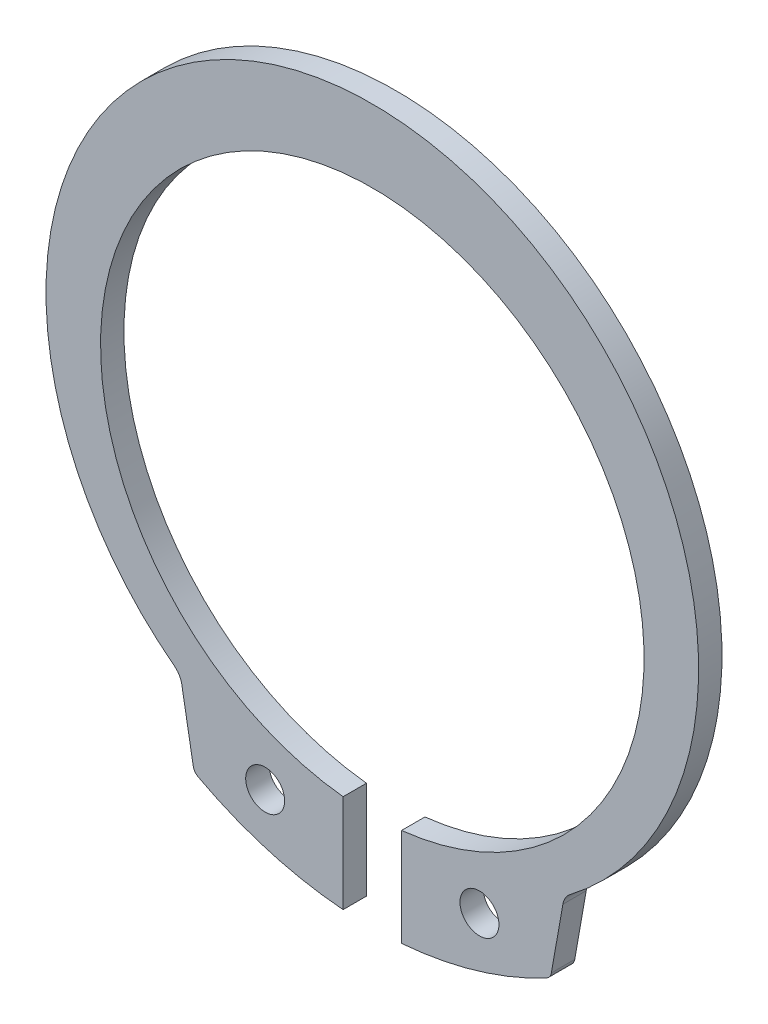
ISO-10303-21;
HEADER;
FILE_DESCRIPTION(('STEP AP214'),'2;1');
FILE_NAME('part.step','',(''),(''),'','','');
FILE_SCHEMA(('AUTOMOTIVE_DESIGN { 1 0 10303 214 1 1 1 1 }'));
ENDSEC;
DATA;
#1=APPLICATION_CONTEXT('core data for automotive mechanical design processes');
#2=APPLICATION_PROTOCOL_DEFINITION('international standard','automotive_design',2000,#1);
#3=PRODUCT_CONTEXT('',#1,'mechanical');
#4=PRODUCT('Part','Part','',(#3));
#5=PRODUCT_RELATED_PRODUCT_CATEGORY('part','',(#4));
#6=PRODUCT_DEFINITION_FORMATION('','',#4);
#7=PRODUCT_DEFINITION_CONTEXT('part definition',#1,'design');
#8=PRODUCT_DEFINITION('design','',#6,#7);
#9=PRODUCT_DEFINITION_SHAPE('','',#8);
#10=(LENGTH_UNIT() NAMED_UNIT(*) SI_UNIT(.MILLI.,.METRE.));
#11=(NAMED_UNIT(*) PLANE_ANGLE_UNIT() SI_UNIT($,.RADIAN.));
#12=(NAMED_UNIT(*) SI_UNIT($,.STERADIAN.) SOLID_ANGLE_UNIT());
#13=UNCERTAINTY_MEASURE_WITH_UNIT(LENGTH_MEASURE(1.E-05),#10,'distance_accuracy_value','');
#14=(GEOMETRIC_REPRESENTATION_CONTEXT(3) GLOBAL_UNCERTAINTY_ASSIGNED_CONTEXT((#13)) GLOBAL_UNIT_ASSIGNED_CONTEXT((#10,
#11,#12)) REPRESENTATION_CONTEXT('',''));
#15=CARTESIAN_POINT('',(0.,0.,0.));
#16=DIRECTION('',(0.,0.,1.));
#17=DIRECTION('',(1.,0.,0.));
#18=AXIS2_PLACEMENT_3D('',#15,#16,#17);
#19=CARTESIAN_POINT('',(0.,-0.93,-1.2));
#20=DIRECTION('',(0.,0.,1.));
#21=DIRECTION('',(1.,0.,0.));
#22=AXIS2_PLACEMENT_3D('',#19,#20,#21);
#23=CYLINDRICAL_SURFACE('',#22,18.95);
#24=CARTESIAN_POINT('',(0.,-0.93,-1.2));
#25=DIRECTION('',(0.,0.,1.));
#26=DIRECTION('',(-1.,0.,0.));
#27=AXIS2_PLACEMENT_3D('',#24,#25,#26);
#28=CIRCLE('',#27,18.95);
#29=CARTESIAN_POINT('',(1.5,-19.8205399605199,-1.2));
#30=VERTEX_POINT('',#29);
#31=CARTESIAN_POINT('',(8.93451802374441,-17.6415794490942,-1.2));
#32=VERTEX_POINT('',#31);
#33=EDGE_CURVE('E175',#30,#32,#28,.T.);
#34=ORIENTED_EDGE('',*,*,#33,.T.);
#35=DIRECTION('',(0.,0.,1.));
#36=VECTOR('',#35,1.);
#37=CARTESIAN_POINT('',(8.93451802374442,-17.6415794490942,-1.2));
#38=LINE('',#37,#36);
#39=CARTESIAN_POINT('',(8.93451802374441,-17.6415794490942,0.));
#40=VERTEX_POINT('',#39);
#41=EDGE_CURVE('E193',#32,#40,#38,.T.);
#42=ORIENTED_EDGE('',*,*,#41,.T.);
#43=CARTESIAN_POINT('',(0.,-0.93,0.));
#44=DIRECTION('',(0.,0.,1.));
#45=DIRECTION('',(-1.,0.,0.));
#46=AXIS2_PLACEMENT_3D('',#43,#44,#45);
#47=CIRCLE('',#46,18.95);
#48=CARTESIAN_POINT('',(1.5,-19.8205399605199,0.));
#49=VERTEX_POINT('',#48);
#50=EDGE_CURVE('E155',#49,#40,#47,.T.);
#51=ORIENTED_EDGE('',*,*,#50,.F.);
#52=DIRECTION('',(0.,0.,1.));
#53=VECTOR('',#52,1.);
#54=CARTESIAN_POINT('',(1.5,-19.8205399605199,-1.2));
#55=LINE('',#54,#53);
#56=EDGE_CURVE('E176',#30,#49,#55,.T.);
#57=ORIENTED_EDGE('',*,*,#56,.F.);
#58=EDGE_LOOP('',(#34,#42,#51,#57));
#59=FACE_BOUND('',#58,.T.);
#60=ADVANCED_FACE('F34',(#59),#23,.T.);
#61=CARTESIAN_POINT('',(1.5,-14.7991203758566,-1.2));
#62=DIRECTION('',(-1.,0.,0.));
#63=DIRECTION('',(0.,0.,1.));
#64=AXIS2_PLACEMENT_3D('',#61,#62,#63);
#65=PLANE('',#64);
#66=DIRECTION('',(0.,-1.,0.));
#67=VECTOR('',#66,1.);
#68=CARTESIAN_POINT('',(1.5,-14.7991203758566,0.));
#69=LINE('',#68,#67);
#70=CARTESIAN_POINT('',(1.5,-14.7991203758566,0.));
#71=VERTEX_POINT('',#70);
#72=EDGE_CURVE('E172',#71,#49,#69,.T.);
#73=ORIENTED_EDGE('',*,*,#72,.F.);
#74=DIRECTION('',(0.,0.,1.));
#75=VECTOR('',#74,1.);
#76=CARTESIAN_POINT('',(1.5,-14.7991203758566,-1.2));
#77=LINE('',#76,#75);
#78=CARTESIAN_POINT('',(1.5,-14.7991203758566,-1.2));
#79=VERTEX_POINT('',#78);
#80=EDGE_CURVE('E179',#79,#71,#77,.T.);
#81=ORIENTED_EDGE('',*,*,#80,.F.);
#82=DIRECTION('',(0.,-1.,0.));
#83=VECTOR('',#82,1.);
#84=CARTESIAN_POINT('',(1.5,-14.7991203758566,-1.2));
#85=LINE('',#84,#83);
#86=EDGE_CURVE('E142',#79,#30,#85,.T.);
#87=ORIENTED_EDGE('',*,*,#86,.T.);
#88=ORIENTED_EDGE('',*,*,#56,.T.);
#89=EDGE_LOOP('',(#73,#81,#87,#88));
#90=FACE_BOUND('',#89,.T.);
#91=ADVANCED_FACE('F274',(#90),#65,.T.);
#92=CARTESIAN_POINT('',(0.,-0.93,-1.2));
#93=DIRECTION('',(0.,0.,1.));
#94=DIRECTION('',(1.,0.,0.));
#95=AXIS2_PLACEMENT_3D('',#92,#93,#94);
#96=CYLINDRICAL_SURFACE('',#95,13.95);
#97=CARTESIAN_POINT('',(0.,-0.93,0.));
#98=DIRECTION('',(0.,0.,-1.));
#99=DIRECTION('',(1.,0.,0.));
#100=AXIS2_PLACEMENT_3D('',#97,#98,#99);
#101=CIRCLE('',#100,13.95);
#102=CARTESIAN_POINT('',(-1.50000000000001,-14.7991203758566,0.));
#103=VERTEX_POINT('',#102);
#104=EDGE_CURVE('E169',#103,#71,#101,.T.);
#105=ORIENTED_EDGE('',*,*,#104,.F.);
#106=DIRECTION('',(0.,0.,1.));
#107=VECTOR('',#106,1.);
#108=CARTESIAN_POINT('',(-1.50000000000001,-14.7991203758566,-1.2));
#109=LINE('',#108,#107);
#110=CARTESIAN_POINT('',(-1.50000000000001,-14.7991203758566,-1.2));
#111=VERTEX_POINT('',#110);
#112=EDGE_CURVE('E141',#111,#103,#109,.T.);
#113=ORIENTED_EDGE('',*,*,#112,.F.);
#114=CARTESIAN_POINT('',(0.,-0.93,-1.2));
#115=DIRECTION('',(0.,0.,-1.));
#116=DIRECTION('',(1.,0.,0.));
#117=AXIS2_PLACEMENT_3D('',#114,#115,#116);
#118=CIRCLE('',#117,13.95);
#119=EDGE_CURVE('E148',#111,#79,#118,.T.);
#120=ORIENTED_EDGE('',*,*,#119,.T.);
#121=ORIENTED_EDGE('',*,*,#80,.T.);
#122=EDGE_LOOP('',(#105,#113,#120,#121));
#123=FACE_BOUND('',#122,.T.);
#124=ADVANCED_FACE('F280',(#123),#96,.F.);
#125=CARTESIAN_POINT('',(-1.5,-14.7991203758566,-1.2));
#126=DIRECTION('',(1.,0.,0.));
#127=DIRECTION('',(0.,0.,-1.));
#128=AXIS2_PLACEMENT_3D('',#125,#126,#127);
#129=PLANE('',#128);
#130=DIRECTION('',(0.,1.,0.));
#131=VECTOR('',#130,1.);
#132=CARTESIAN_POINT('',(-1.5,-14.7991203758566,0.));
#133=LINE('',#132,#131);
#134=CARTESIAN_POINT('',(-1.5,-19.8205399605199,0.));
#135=VERTEX_POINT('',#134);
#136=EDGE_CURVE('E140',#135,#103,#133,.T.);
#137=ORIENTED_EDGE('',*,*,#136,.F.);
#138=DIRECTION('',(0.,0.,1.));
#139=VECTOR('',#138,1.);
#140=CARTESIAN_POINT('',(-1.5,-19.8205399605199,-1.2));
#141=LINE('',#140,#139);
#142=CARTESIAN_POINT('',(-1.5,-19.8205399605199,-1.2));
#143=VERTEX_POINT('',#142);
#144=EDGE_CURVE('E125',#143,#135,#141,.T.);
#145=ORIENTED_EDGE('',*,*,#144,.F.);
#146=DIRECTION('',(0.,1.,0.));
#147=VECTOR('',#146,1.);
#148=CARTESIAN_POINT('',(-1.5,-14.7991203758566,-1.2));
#149=LINE('',#148,#147);
#150=EDGE_CURVE('E133',#143,#111,#149,.T.);
#151=ORIENTED_EDGE('',*,*,#150,.T.);
#152=ORIENTED_EDGE('',*,*,#112,.T.);
#153=EDGE_LOOP('',(#137,#145,#151,#152));
#154=FACE_BOUND('',#153,.T.);
#155=ADVANCED_FACE('F138',(#154),#129,.T.);
#156=CARTESIAN_POINT('',(0.,-0.93,-1.2));
#157=DIRECTION('',(0.,0.,1.));
#158=DIRECTION('',(1.,0.,0.));
#159=AXIS2_PLACEMENT_3D('',#156,#157,#158);
#160=CYLINDRICAL_SURFACE('',#159,18.95);
#161=CARTESIAN_POINT('',(0.,-0.93,0.));
#162=DIRECTION('',(0.,0.,1.));
#163=DIRECTION('',(1.,0.,0.));
#164=AXIS2_PLACEMENT_3D('',#161,#162,#163);
#165=CIRCLE('',#164,18.95);
#166=CARTESIAN_POINT('',(-8.93451802374441,-17.6415794490942,0.));
#167=VERTEX_POINT('',#166);
#168=EDGE_CURVE('E166',#167,#135,#165,.T.);
#169=ORIENTED_EDGE('',*,*,#168,.F.);
#170=DIRECTION('',(0.,0.,1.));
#171=VECTOR('',#170,1.);
#172=CARTESIAN_POINT('',(-8.93451802374442,-17.6415794490942,-1.2));
#173=LINE('',#172,#171);
#174=CARTESIAN_POINT('',(-8.93451802374441,-17.6415794490942,-1.2));
#175=VERTEX_POINT('',#174);
#176=EDGE_CURVE('E128',#167,#175,#173,.F.);
#177=ORIENTED_EDGE('',*,*,#176,.T.);
#178=CARTESIAN_POINT('',(0.,-0.93,-1.2));
#179=DIRECTION('',(0.,0.,1.));
#180=DIRECTION('',(1.,0.,0.));
#181=AXIS2_PLACEMENT_3D('',#178,#179,#180);
#182=CIRCLE('',#181,18.95);
#183=EDGE_CURVE('E121',#175,#143,#182,.T.);
#184=ORIENTED_EDGE('',*,*,#183,.T.);
#185=ORIENTED_EDGE('',*,*,#144,.T.);
#186=EDGE_LOOP('',(#169,#177,#184,#185));
#187=FACE_BOUND('',#186,.T.);
#188=ADVANCED_FACE('F124',(#187),#160,.T.);
#189=CARTESIAN_POINT('',(-9.85069421202086,-13.5471887689387,-1.2));
#190=DIRECTION('',(-0.984807753012208,-0.173648177666931,0.));
#191=DIRECTION('',(0.173648177666931,-0.984807753012208,0.));
#192=AXIS2_PLACEMENT_3D('',#189,#190,#191);
#193=PLANE('',#192);
#194=DIRECTION('',(0.173648177666931,-0.984807753012208,0.));
#195=VECTOR('',#194,1.);
#196=CARTESIAN_POINT('',(-9.85069421202086,-13.5471887689387,0.));
#197=LINE('',#196,#195);
#198=CARTESIAN_POINT('',(-9.78175191935103,-13.9381799399598,0.));
#199=VERTEX_POINT('',#198);
#200=CARTESIAN_POINT('',(-9.1911826384103,-17.2874647661837,0.));
#201=VERTEX_POINT('',#200);
#202=EDGE_CURVE('E164',#199,#201,#197,.T.);
#203=ORIENTED_EDGE('',*,*,#202,.F.);
#204=DIRECTION('',(0.,0.,-1.));
#205=VECTOR('',#204,1.);
#206=CARTESIAN_POINT('',(-9.78175191935103,-13.9381799399598,-1.2));
#207=LINE('',#206,#205);
#208=CARTESIAN_POINT('',(-9.78175191935103,-13.9381799399598,-1.2));
#209=VERTEX_POINT('',#208);
#210=EDGE_CURVE('E55',#199,#209,#207,.T.);
#211=ORIENTED_EDGE('',*,*,#210,.T.);
#212=DIRECTION('',(0.173648177666931,-0.984807753012208,0.));
#213=VECTOR('',#212,1.);
#214=CARTESIAN_POINT('',(-9.85069421202086,-13.5471887689387,-1.2));
#215=LINE('',#214,#213);
#216=CARTESIAN_POINT('',(-9.1911826384103,-17.2874647661837,-1.2));
#217=VERTEX_POINT('',#216);
#218=EDGE_CURVE('E134',#209,#217,#215,.T.);
#219=ORIENTED_EDGE('',*,*,#218,.T.);
#220=DIRECTION('',(0.,0.,1.));
#221=VECTOR('',#220,1.);
#222=CARTESIAN_POINT('',(-9.1911826384103,-17.2874647661837,-1.2));
#223=LINE('',#222,#221);
#224=EDGE_CURVE('E178',#217,#201,#223,.T.);
#225=ORIENTED_EDGE('',*,*,#224,.T.);
#226=EDGE_LOOP('',(#203,#211,#219,#225));
#227=FACE_BOUND('',#226,.T.);
#228=ADVANCED_FACE('F352',(#227),#193,.T.);
#229=CARTESIAN_POINT('',(0.,0.,-1.2));
#230=DIRECTION('',(0.,0.,1.));
#231=DIRECTION('',(1.,0.,0.));
#232=AXIS2_PLACEMENT_3D('',#229,#230,#231);
#233=CYLINDRICAL_SURFACE('',#232,16.75);
#234=CARTESIAN_POINT('',(0.,0.,0.));
#235=DIRECTION('',(0.,0.,1.));
#236=DIRECTION('',(1.,0.,0.));
#237=AXIS2_PLACEMENT_3D('',#234,#235,#236);
#238=CIRCLE('',#237,16.75);
#239=CARTESIAN_POINT('',(10.1599929302583,-13.3167955476196,0.));
#240=VERTEX_POINT('',#239);
#241=CARTESIAN_POINT('',(-10.1599929302583,-13.3167955476196,0.));
#242=VERTEX_POINT('',#241);
#243=EDGE_CURVE('E162',#240,#242,#238,.T.);
#244=ORIENTED_EDGE('',*,*,#243,.F.);
#245=DIRECTION('',(0.,0.,1.));
#246=VECTOR('',#245,1.);
#247=CARTESIAN_POINT('',(10.1599929302583,-13.3167955476196,-1.2));
#248=LINE('',#247,#246);
#249=CARTESIAN_POINT('',(10.1599929302583,-13.3167955476196,-1.2));
#250=VERTEX_POINT('',#249);
#251=EDGE_CURVE('E204',#240,#250,#248,.F.);
#252=ORIENTED_EDGE('',*,*,#251,.T.);
#253=CARTESIAN_POINT('',(0.,0.,-1.2));
#254=DIRECTION('',(0.,0.,1.));
#255=DIRECTION('',(1.,0.,0.));
#256=AXIS2_PLACEMENT_3D('',#253,#254,#255);
#257=CIRCLE('',#256,16.75);
#258=CARTESIAN_POINT('',(-10.1599929302583,-13.3167955476196,-1.2));
#259=VERTEX_POINT('',#258);
#260=EDGE_CURVE('E217',#250,#259,#257,.T.);
#261=ORIENTED_EDGE('',*,*,#260,.T.);
#262=DIRECTION('',(0.,0.,1.));
#263=VECTOR('',#262,1.);
#264=CARTESIAN_POINT('',(-10.1599929302583,-13.3167955476196,-1.2));
#265=LINE('',#264,#263);
#266=EDGE_CURVE('E201',#259,#242,#265,.T.);
#267=ORIENTED_EDGE('',*,*,#266,.T.);
#268=EDGE_LOOP('',(#244,#252,#261,#267));
#269=FACE_BOUND('',#268,.T.);
#270=ADVANCED_FACE('F230',(#269),#233,.T.);
#271=CARTESIAN_POINT('',(9.85069421202086,-13.5471887689387,-1.2));
#272=DIRECTION('',(0.984807753012208,-0.173648177666931,0.));
#273=DIRECTION('',(0.173648177666931,0.984807753012208,0.));
#274=AXIS2_PLACEMENT_3D('',#271,#272,#273);
#275=PLANE('',#274);
#276=DIRECTION('',(0.173648177666931,0.984807753012208,0.));
#277=VECTOR('',#276,1.);
#278=CARTESIAN_POINT('',(9.85069421202086,-13.5471887689387,-1.2));
#279=LINE('',#278,#277);
#280=CARTESIAN_POINT('',(9.1911826384103,-17.2874647661837,-1.2));
#281=VERTEX_POINT('',#280);
#282=CARTESIAN_POINT('',(9.78175191935103,-13.9381799399598,-1.2));
#283=VERTEX_POINT('',#282);
#284=EDGE_CURVE('E214',#281,#283,#279,.T.);
#285=ORIENTED_EDGE('',*,*,#284,.T.);
#286=DIRECTION('',(0.,0.,-1.));
#287=VECTOR('',#286,1.);
#288=CARTESIAN_POINT('',(9.78175191935103,-13.9381799399598,0.));
#289=LINE('',#288,#287);
#290=CARTESIAN_POINT('',(9.78175191935103,-13.9381799399598,0.));
#291=VERTEX_POINT('',#290);
#292=EDGE_CURVE('E198',#283,#291,#289,.F.);
#293=ORIENTED_EDGE('',*,*,#292,.T.);
#294=DIRECTION('',(0.173648177666931,0.984807753012208,0.));
#295=VECTOR('',#294,1.);
#296=CARTESIAN_POINT('',(9.85069421202086,-13.5471887689387,0.));
#297=LINE('',#296,#295);
#298=CARTESIAN_POINT('',(9.1911826384103,-17.2874647661837,0.));
#299=VERTEX_POINT('',#298);
#300=EDGE_CURVE('E158',#299,#291,#297,.T.);
#301=ORIENTED_EDGE('',*,*,#300,.F.);
#302=DIRECTION('',(0.,0.,1.));
#303=VECTOR('',#302,1.);
#304=CARTESIAN_POINT('',(9.1911826384103,-17.2874647661837,-1.2));
#305=LINE('',#304,#303);
#306=EDGE_CURVE('E196',#299,#281,#305,.F.);
#307=ORIENTED_EDGE('',*,*,#306,.T.);
#308=EDGE_LOOP('',(#285,#293,#301,#307));
#309=FACE_BOUND('',#308,.T.);
#310=ADVANCED_FACE('F222',(#309),#275,.T.);
#311=CARTESIAN_POINT('',(0.,-0.93,-1.2));
#312=DIRECTION('',(0.,0.,-1.));
#313=DIRECTION('',(-1.,0.,0.));
#314=AXIS2_PLACEMENT_3D('',#311,#312,#313);
#315=PLANE('',#314);
#316=CARTESIAN_POINT('',(5.5,-16.486349186104,-1.2));
#317=DIRECTION('',(0.,0.,1.));
#318=DIRECTION('',(-1.,0.,0.));
#319=AXIS2_PLACEMENT_3D('',#316,#317,#318);
#320=CIRCLE('',#319,1.);
#321=CARTESIAN_POINT('',(4.5,-16.486349186104,-1.2));
#322=VERTEX_POINT('',#321);
#323=EDGE_CURVE('E242',#322,#322,#320,.T.);
#324=ORIENTED_EDGE('',*,*,#323,.T.);
#325=EDGE_LOOP('',(#324));
#326=FACE_BOUND('',#325,.T.);
#327=CARTESIAN_POINT('',(-5.5,-16.486349186104,-1.2));
#328=DIRECTION('',(0.,0.,1.));
#329=DIRECTION('',(1.,0.,0.));
#330=AXIS2_PLACEMENT_3D('',#327,#328,#329);
#331=CIRCLE('',#330,1.);
#332=CARTESIAN_POINT('',(-4.5,-16.486349186104,-1.2));
#333=VERTEX_POINT('',#332);
#334=EDGE_CURVE('E159',#333,#333,#331,.T.);
#335=ORIENTED_EDGE('',*,*,#334,.T.);
#336=EDGE_LOOP('',(#335));
#337=FACE_BOUND('',#336,.T.);
#338=ORIENTED_EDGE('',*,*,#183,.F.);
#339=CARTESIAN_POINT('',(-8.69877876190419,-17.2006406773502,-1.2));
#340=DIRECTION('',(0.,0.,-1.));
#341=DIRECTION('',(-1.,0.,0.));
#342=AXIS2_PLACEMENT_3D('',#339,#340,#341);
#343=CIRCLE('',#342,0.5);
#344=EDGE_CURVE('E191',#175,#217,#343,.T.);
#345=ORIENTED_EDGE('',*,*,#344,.T.);
#346=ORIENTED_EDGE('',*,*,#218,.F.);
#347=CARTESIAN_POINT('',(-10.7665596723632,-14.1118281176268,-1.2));
#348=DIRECTION('',(0.,0.,-1.));
#349=DIRECTION('',(-1.,0.,0.));
#350=AXIS2_PLACEMENT_3D('',#347,#348,#349);
#351=CIRCLE('',#350,1.);
#352=EDGE_CURVE('E11',#209,#259,#351,.F.);
#353=ORIENTED_EDGE('',*,*,#352,.T.);
#354=ORIENTED_EDGE('',*,*,#260,.F.);
#355=CARTESIAN_POINT('',(10.7665596723632,-14.1118281176268,-1.2));
#356=DIRECTION('',(0.,0.,-1.));
#357=DIRECTION('',(-1.,0.,0.));
#358=AXIS2_PLACEMENT_3D('',#355,#356,#357);
#359=CIRCLE('',#358,1.);
#360=EDGE_CURVE('E209',#250,#283,#359,.F.);
#361=ORIENTED_EDGE('',*,*,#360,.T.);
#362=ORIENTED_EDGE('',*,*,#284,.F.);
#363=CARTESIAN_POINT('',(8.69877876190419,-17.2006406773502,-1.2));
#364=DIRECTION('',(0.,0.,-1.));
#365=DIRECTION('',(-1.,0.,0.));
#366=AXIS2_PLACEMENT_3D('',#363,#364,#365);
#367=CIRCLE('',#366,0.5);
#368=EDGE_CURVE('E189',#281,#32,#367,.T.);
#369=ORIENTED_EDGE('',*,*,#368,.T.);
#370=ORIENTED_EDGE('',*,*,#33,.F.);
#371=ORIENTED_EDGE('',*,*,#86,.F.);
#372=ORIENTED_EDGE('',*,*,#119,.F.);
#373=ORIENTED_EDGE('',*,*,#150,.F.);
#374=EDGE_LOOP('',(#338,#345,#346,#353,#354,#361,#362,#369,#370,#371,#372,#373));
#375=FACE_BOUND('',#374,.T.);
#376=ADVANCED_FACE('F145',(#326,#337,#375),#315,.T.);
#377=CARTESIAN_POINT('',(0.,-0.93,0.));
#378=DIRECTION('',(0.,0.,-1.));
#379=DIRECTION('',(-1.,0.,0.));
#380=AXIS2_PLACEMENT_3D('',#377,#378,#379);
#381=PLANE('',#380);
#382=CARTESIAN_POINT('',(5.5,-16.486349186104,0.));
#383=DIRECTION('',(0.,0.,1.));
#384=DIRECTION('',(-1.,0.,0.));
#385=AXIS2_PLACEMENT_3D('',#382,#383,#384);
#386=CIRCLE('',#385,1.);
#387=CARTESIAN_POINT('',(4.5,-16.486349186104,0.));
#388=VERTEX_POINT('',#387);
#389=EDGE_CURVE('E245',#388,#388,#386,.T.);
#390=ORIENTED_EDGE('',*,*,#389,.F.);
#391=EDGE_LOOP('',(#390));
#392=FACE_BOUND('',#391,.T.);
#393=CARTESIAN_POINT('',(-5.5,-16.486349186104,0.));
#394=DIRECTION('',(0.,0.,1.));
#395=DIRECTION('',(1.,0.,0.));
#396=AXIS2_PLACEMENT_3D('',#393,#394,#395);
#397=CIRCLE('',#396,1.);
#398=CARTESIAN_POINT('',(-4.5,-16.486349186104,0.));
#399=VERTEX_POINT('',#398);
#400=EDGE_CURVE('E239',#399,#399,#397,.T.);
#401=ORIENTED_EDGE('',*,*,#400,.F.);
#402=EDGE_LOOP('',(#401));
#403=FACE_BOUND('',#402,.T.);
#404=ORIENTED_EDGE('',*,*,#243,.T.);
#405=CARTESIAN_POINT('',(-10.7665596723632,-14.1118281176268,0.));
#406=DIRECTION('',(0.,0.,-1.));
#407=DIRECTION('',(-1.,0.,0.));
#408=AXIS2_PLACEMENT_3D('',#405,#406,#407);
#409=CIRCLE('',#408,1.);
#410=EDGE_CURVE('E42',#242,#199,#409,.T.);
#411=ORIENTED_EDGE('',*,*,#410,.T.);
#412=ORIENTED_EDGE('',*,*,#202,.T.);
#413=CARTESIAN_POINT('',(-8.69877876190419,-17.2006406773502,0.));
#414=DIRECTION('',(0.,0.,-1.));
#415=DIRECTION('',(-1.,0.,0.));
#416=AXIS2_PLACEMENT_3D('',#413,#414,#415);
#417=CIRCLE('',#416,0.5);
#418=EDGE_CURVE('E186',#201,#167,#417,.F.);
#419=ORIENTED_EDGE('',*,*,#418,.T.);
#420=ORIENTED_EDGE('',*,*,#168,.T.);
#421=ORIENTED_EDGE('',*,*,#136,.T.);
#422=ORIENTED_EDGE('',*,*,#104,.T.);
#423=ORIENTED_EDGE('',*,*,#72,.T.);
#424=ORIENTED_EDGE('',*,*,#50,.T.);
#425=CARTESIAN_POINT('',(8.69877876190419,-17.2006406773502,0.));
#426=DIRECTION('',(0.,0.,-1.));
#427=DIRECTION('',(-1.,0.,0.));
#428=AXIS2_PLACEMENT_3D('',#425,#426,#427);
#429=CIRCLE('',#428,0.5);
#430=EDGE_CURVE('E184',#40,#299,#429,.F.);
#431=ORIENTED_EDGE('',*,*,#430,.T.);
#432=ORIENTED_EDGE('',*,*,#300,.T.);
#433=CARTESIAN_POINT('',(10.7665596723632,-14.1118281176268,0.));
#434=DIRECTION('',(0.,0.,-1.));
#435=DIRECTION('',(-1.,0.,0.));
#436=AXIS2_PLACEMENT_3D('',#433,#434,#435);
#437=CIRCLE('',#436,1.);
#438=EDGE_CURVE('E207',#291,#240,#437,.T.);
#439=ORIENTED_EDGE('',*,*,#438,.T.);
#440=EDGE_LOOP('',(#404,#411,#412,#419,#420,#421,#422,#423,#424,#431,#432,#439));
#441=FACE_BOUND('',#440,.T.);
#442=ADVANCED_FACE('F228',(#392,#403,#441),#381,.F.);
#443=CARTESIAN_POINT('',(-5.5,-16.486349186104,-1.2));
#444=DIRECTION('',(0.,0.,1.));
#445=DIRECTION('',(1.,0.,0.));
#446=AXIS2_PLACEMENT_3D('',#443,#444,#445);
#447=CYLINDRICAL_SURFACE('',#446,1.);
#448=ORIENTED_EDGE('',*,*,#334,.F.);
#449=EDGE_LOOP('',(#448));
#450=FACE_BOUND('',#449,.T.);
#451=ORIENTED_EDGE('',*,*,#400,.T.);
#452=EDGE_LOOP('',(#451));
#453=FACE_BOUND('',#452,.T.);
#454=ADVANCED_FACE('F257',(#450,#453),#447,.F.);
#455=CARTESIAN_POINT('',(5.5,-16.486349186104,-1.2));
#456=DIRECTION('',(0.,0.,1.));
#457=DIRECTION('',(1.,0.,0.));
#458=AXIS2_PLACEMENT_3D('',#455,#456,#457);
#459=CYLINDRICAL_SURFACE('',#458,1.);
#460=ORIENTED_EDGE('',*,*,#323,.F.);
#461=EDGE_LOOP('',(#460));
#462=FACE_BOUND('',#461,.T.);
#463=ORIENTED_EDGE('',*,*,#389,.T.);
#464=EDGE_LOOP('',(#463));
#465=FACE_BOUND('',#464,.T.);
#466=ADVANCED_FACE('F253',(#462,#465),#459,.F.);
#467=CARTESIAN_POINT('',(-8.69877876190419,-17.2006406773502,-1.2));
#468=DIRECTION('',(0.,0.,1.));
#469=DIRECTION('',(1.,0.,0.));
#470=AXIS2_PLACEMENT_3D('',#467,#468,#469);
#471=CYLINDRICAL_SURFACE('',#470,0.5);
#472=ORIENTED_EDGE('',*,*,#344,.F.);
#473=ORIENTED_EDGE('',*,*,#176,.F.);
#474=ORIENTED_EDGE('',*,*,#418,.F.);
#475=ORIENTED_EDGE('',*,*,#224,.F.);
#476=EDGE_LOOP('',(#472,#473,#474,#475));
#477=FACE_BOUND('',#476,.T.);
#478=ADVANCED_FACE('F256',(#477),#471,.T.);
#479=CARTESIAN_POINT('',(8.69877876190419,-17.2006406773502,-1.2));
#480=DIRECTION('',(0.,0.,1.));
#481=DIRECTION('',(1.,0.,0.));
#482=AXIS2_PLACEMENT_3D('',#479,#480,#481);
#483=CYLINDRICAL_SURFACE('',#482,0.5);
#484=ORIENTED_EDGE('',*,*,#368,.F.);
#485=ORIENTED_EDGE('',*,*,#306,.F.);
#486=ORIENTED_EDGE('',*,*,#430,.F.);
#487=ORIENTED_EDGE('',*,*,#41,.F.);
#488=EDGE_LOOP('',(#484,#485,#486,#487));
#489=FACE_BOUND('',#488,.T.);
#490=ADVANCED_FACE('F288',(#489),#483,.T.);
#491=CARTESIAN_POINT('',(10.7665596723632,-14.1118281176268,-1.2));
#492=DIRECTION('',(0.,0.,1.));
#493=DIRECTION('',(1.,0.,0.));
#494=AXIS2_PLACEMENT_3D('',#491,#492,#493);
#495=CYLINDRICAL_SURFACE('',#494,1.);
#496=ORIENTED_EDGE('',*,*,#360,.F.);
#497=ORIENTED_EDGE('',*,*,#251,.F.);
#498=ORIENTED_EDGE('',*,*,#438,.F.);
#499=ORIENTED_EDGE('',*,*,#292,.F.);
#500=EDGE_LOOP('',(#496,#497,#498,#499));
#501=FACE_BOUND('',#500,.T.);
#502=ADVANCED_FACE('F226',(#501),#495,.F.);
#503=CARTESIAN_POINT('',(-10.7665596723632,-14.1118281176268,-1.2));
#504=DIRECTION('',(0.,0.,1.));
#505=DIRECTION('',(1.,0.,0.));
#506=AXIS2_PLACEMENT_3D('',#503,#504,#505);
#507=CYLINDRICAL_SURFACE('',#506,1.);
#508=ORIENTED_EDGE('',*,*,#352,.F.);
#509=ORIENTED_EDGE('',*,*,#210,.F.);
#510=ORIENTED_EDGE('',*,*,#410,.F.);
#511=ORIENTED_EDGE('',*,*,#266,.F.);
#512=EDGE_LOOP('',(#508,#509,#510,#511));
#513=FACE_BOUND('',#512,.T.);
#514=ADVANCED_FACE('F36',(#513),#507,.F.);
#515=CLOSED_SHELL('',(#60,#91,#124,#155,#188,#228,#270,#310,#376,#442,#454,#466,#478,#490,#502,#514));
#516=MANIFOLD_SOLID_BREP('B2',#515);
#517=ADVANCED_BREP_SHAPE_REPRESENTATION('',(#18,#516),#14);
#518=SHAPE_DEFINITION_REPRESENTATION(#9,#517);
ENDSEC;
END-ISO-10303-21;
